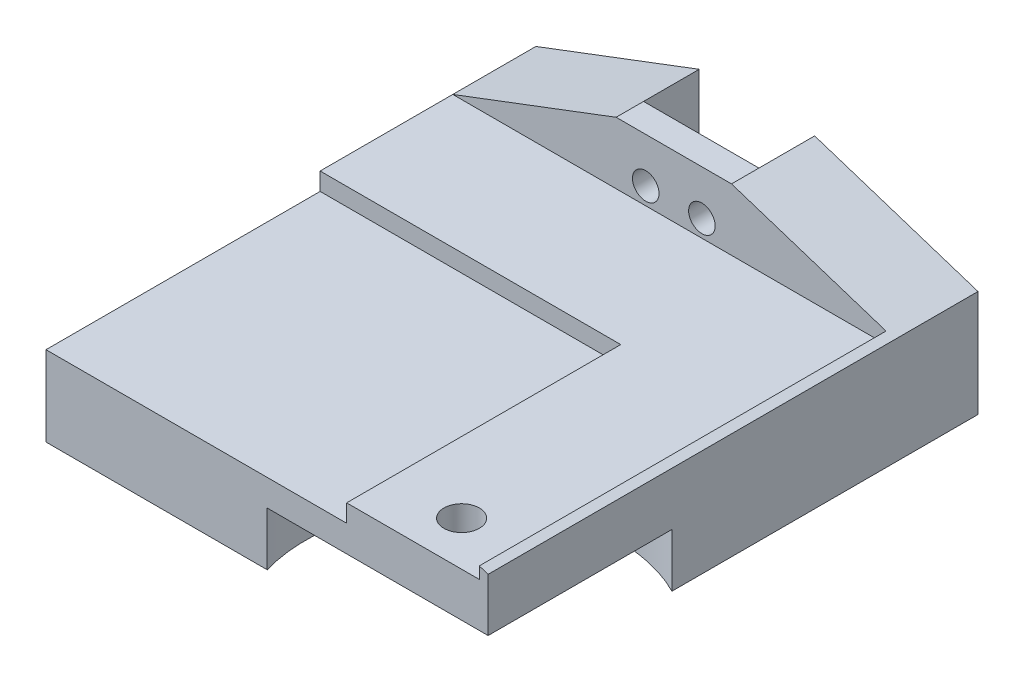
ISO-10303-21;
HEADER;
FILE_DESCRIPTION(('STEP AP214'),'2;1');
FILE_NAME('part.step','',(''),(''),'','','');
FILE_SCHEMA(('AUTOMOTIVE_DESIGN { 1 0 10303 214 1 1 1 1 }'));
ENDSEC;
DATA;
#1=APPLICATION_CONTEXT('core data for automotive mechanical design processes');
#2=APPLICATION_PROTOCOL_DEFINITION('international standard','automotive_design',2000,#1);
#3=PRODUCT_CONTEXT('',#1,'mechanical');
#4=PRODUCT('Part','Part','',(#3));
#5=PRODUCT_RELATED_PRODUCT_CATEGORY('part','',(#4));
#6=PRODUCT_DEFINITION_FORMATION('','',#4);
#7=PRODUCT_DEFINITION_CONTEXT('part definition',#1,'design');
#8=PRODUCT_DEFINITION('design','',#6,#7);
#9=PRODUCT_DEFINITION_SHAPE('','',#8);
#10=(LENGTH_UNIT() NAMED_UNIT(*) SI_UNIT(.MILLI.,.METRE.));
#11=(NAMED_UNIT(*) PLANE_ANGLE_UNIT() SI_UNIT($,.RADIAN.));
#12=(NAMED_UNIT(*) SI_UNIT($,.STERADIAN.) SOLID_ANGLE_UNIT());
#13=UNCERTAINTY_MEASURE_WITH_UNIT(LENGTH_MEASURE(1.E-05),#10,'distance_accuracy_value','');
#14=(GEOMETRIC_REPRESENTATION_CONTEXT(3) GLOBAL_UNCERTAINTY_ASSIGNED_CONTEXT((#13)) GLOBAL_UNIT_ASSIGNED_CONTEXT((#10,
#11,#12)) REPRESENTATION_CONTEXT('',''));
#15=CARTESIAN_POINT('',(0.,0.,0.));
#16=DIRECTION('',(0.,0.,1.));
#17=DIRECTION('',(1.,0.,0.));
#18=AXIS2_PLACEMENT_3D('',#15,#16,#17);
#19=CARTESIAN_POINT('',(42.,18.05,-5.));
#20=DIRECTION('',(0.,-1.,0.));
#21=DIRECTION('',(0.,0.,-1.));
#22=AXIS2_PLACEMENT_3D('',#19,#20,#21);
#23=CYLINDRICAL_SURFACE('',#22,2.);
#24=CARTESIAN_POINT('',(42.,11.05,-5.));
#25=DIRECTION('',(0.,-1.,0.));
#26=DIRECTION('',(0.,0.,-1.));
#27=AXIS2_PLACEMENT_3D('',#24,#25,#26);
#28=CIRCLE('',#27,2.);
#29=CARTESIAN_POINT('',(42.,11.05,-7.));
#30=VERTEX_POINT('',#29);
#31=EDGE_CURVE('E380',#30,#30,#28,.T.);
#32=ORIENTED_EDGE('',*,*,#31,.F.);
#33=EDGE_LOOP('',(#32));
#34=FACE_BOUND('',#33,.T.);
#35=CARTESIAN_POINT('',(42.,6.05,-5.));
#36=DIRECTION('',(0.,-1.,0.));
#37=DIRECTION('',(0.,0.,-1.));
#38=AXIS2_PLACEMENT_3D('',#35,#36,#37);
#39=CIRCLE('',#38,2.);
#40=CARTESIAN_POINT('',(42.,6.05,-7.));
#41=VERTEX_POINT('',#40);
#42=EDGE_CURVE('E237',#41,#41,#39,.T.);
#43=ORIENTED_EDGE('',*,*,#42,.T.);
#44=EDGE_LOOP('',(#43));
#45=FACE_BOUND('',#44,.T.);
#46=ADVANCED_FACE('F43',(#34,#45),#23,.F.);
#47=CARTESIAN_POINT('',(0.,18.05,-55.4));
#48=DIRECTION('',(0.,0.,1.));
#49=DIRECTION('',(1.,0.,0.));
#50=AXIS2_PLACEMENT_3D('',#47,#48,#49);
#51=PLANE('',#50);
#52=DIRECTION('',(0.,-1.,0.));
#53=VECTOR('',#52,1.);
#54=CARTESIAN_POINT('',(31.525,18.05,-55.4));
#55=LINE('',#54,#53);
#56=CARTESIAN_POINT('',(31.525,18.05,-55.4));
#57=VERTEX_POINT('',#56);
#58=CARTESIAN_POINT('',(31.525,6.,-55.4));
#59=VERTEX_POINT('',#58);
#60=EDGE_CURVE('E324',#57,#59,#55,.T.);
#61=ORIENTED_EDGE('',*,*,#60,.F.);
#62=DIRECTION('',(-0.951100252619325,0.308882355383819,0.));
#63=VECTOR('',#62,1.);
#64=CARTESIAN_POINT('',(31.525,18.05,-55.4));
#65=LINE('',#64,#63);
#66=CARTESIAN_POINT('',(50.,12.0499999999999,-55.4));
#67=VERTEX_POINT('',#66);
#68=EDGE_CURVE('E414',#57,#67,#65,.F.);
#69=ORIENTED_EDGE('',*,*,#68,.T.);
#70=DIRECTION('',(0.,-1.,0.));
#71=VECTOR('',#70,1.);
#72=CARTESIAN_POINT('',(50.,18.05,-55.4));
#73=LINE('',#72,#71);
#74=CARTESIAN_POINT('',(50.,0.,-55.4));
#75=VERTEX_POINT('',#74);
#76=EDGE_CURVE('E217',#67,#75,#73,.T.);
#77=ORIENTED_EDGE('',*,*,#76,.T.);
#78=DIRECTION('',(-1.,0.,0.));
#79=VECTOR('',#78,1.);
#80=CARTESIAN_POINT('',(0.,0.,-55.4));
#81=LINE('',#80,#79);
#82=CARTESIAN_POINT('',(25.875,0.,-55.4));
#83=VERTEX_POINT('',#82);
#84=EDGE_CURVE('E391',#75,#83,#81,.T.);
#85=ORIENTED_EDGE('',*,*,#84,.T.);
#86=DIRECTION('',(0.,1.,0.));
#87=VECTOR('',#86,1.);
#88=CARTESIAN_POINT('',(25.875,0.,-55.4));
#89=LINE('',#88,#87);
#90=CARTESIAN_POINT('',(25.875,6.,-55.4));
#91=VERTEX_POINT('',#90);
#92=EDGE_CURVE('E304',#83,#91,#89,.T.);
#93=ORIENTED_EDGE('',*,*,#92,.T.);
#94=DIRECTION('',(-1.,0.,0.));
#95=VECTOR('',#94,1.);
#96=CARTESIAN_POINT('',(31.525,6.,-55.4));
#97=LINE('',#96,#95);
#98=EDGE_CURVE('E349',#59,#91,#97,.T.);
#99=ORIENTED_EDGE('',*,*,#98,.F.);
#100=EDGE_LOOP('',(#61,#69,#77,#85,#93,#99));
#101=FACE_BOUND('',#100,.T.);
#102=ADVANCED_FACE('F420',(#101),#51,.F.);
#103=CARTESIAN_POINT('',(0.,18.05,0.));
#104=DIRECTION('',(0.,-1.,0.));
#105=DIRECTION('',(0.,0.,-1.));
#106=AXIS2_PLACEMENT_3D('',#103,#104,#105);
#107=PLANE('',#106);
#108=DIRECTION('',(-1.,0.,0.));
#109=VECTOR('',#108,1.);
#110=CARTESIAN_POINT('',(0.,18.05,-46.));
#111=LINE('',#110,#109);
#112=CARTESIAN_POINT('',(31.525,18.05,-46.));
#113=VERTEX_POINT('',#112);
#114=CARTESIAN_POINT('',(18.4750000000002,18.05,-46.));
#115=VERTEX_POINT('',#114);
#116=EDGE_CURVE('E356',#113,#115,#111,.T.);
#117=ORIENTED_EDGE('',*,*,#116,.F.);
#118=DIRECTION('',(0.,0.,-1.));
#119=VECTOR('',#118,1.);
#120=CARTESIAN_POINT('',(31.525,18.05,0.));
#121=LINE('',#120,#119);
#122=CARTESIAN_POINT('',(31.525,18.05,-49.1));
#123=VERTEX_POINT('',#122);
#124=EDGE_CURVE('E411',#113,#123,#121,.T.);
#125=ORIENTED_EDGE('',*,*,#124,.T.);
#126=DIRECTION('',(1.,0.,0.));
#127=VECTOR('',#126,1.);
#128=CARTESIAN_POINT('',(31.525,18.05,-49.1));
#129=LINE('',#128,#127);
#130=CARTESIAN_POINT('',(18.475,18.05,-49.1));
#131=VERTEX_POINT('',#130);
#132=EDGE_CURVE('E343',#131,#123,#129,.T.);
#133=ORIENTED_EDGE('',*,*,#132,.F.);
#134=DIRECTION('',(0.,0.,1.));
#135=VECTOR('',#134,1.);
#136=CARTESIAN_POINT('',(18.4750000000002,18.05,0.));
#137=LINE('',#136,#135);
#138=EDGE_CURVE('E398',#131,#115,#137,.T.);
#139=ORIENTED_EDGE('',*,*,#138,.T.);
#140=EDGE_LOOP('',(#117,#125,#133,#139));
#141=FACE_BOUND('',#140,.T.);
#142=ADVANCED_FACE('F432',(#141),#107,.F.);
#143=CARTESIAN_POINT('',(0.,0.,0.));
#144=DIRECTION('',(0.,-1.,0.));
#145=DIRECTION('',(0.,0.,-1.));
#146=AXIS2_PLACEMENT_3D('',#143,#144,#145);
#147=PLANE('',#146);
#148=CARTESIAN_POINT('',(42.,0.,-5.));
#149=DIRECTION('',(0.,-1.,0.));
#150=DIRECTION('',(0.,0.,-1.));
#151=AXIS2_PLACEMENT_3D('',#148,#149,#150);
#152=CIRCLE('',#151,17.7);
#153=CARTESIAN_POINT('',(25.0208951943867,0.,0.));
#154=VERTEX_POINT('',#153);
#155=CARTESIAN_POINT('',(50.,0.,-20.7889201657365));
#156=VERTEX_POINT('',#155);
#157=EDGE_CURVE('E225',#154,#156,#152,.T.);
#158=ORIENTED_EDGE('',*,*,#157,.F.);
#159=DIRECTION('',(1.,0.,0.));
#160=VECTOR('',#159,1.);
#161=CARTESIAN_POINT('',(0.,0.,0.));
#162=LINE('',#161,#160);
#163=CARTESIAN_POINT('',(0.,0.,0.));
#164=VERTEX_POINT('',#163);
#165=EDGE_CURVE('E385',#164,#154,#162,.T.);
#166=ORIENTED_EDGE('',*,*,#165,.F.);
#167=DIRECTION('',(0.,0.,1.));
#168=VECTOR('',#167,1.);
#169=CARTESIAN_POINT('',(0.,0.,0.));
#170=LINE('',#169,#168);
#171=CARTESIAN_POINT('',(0.,0.,-55.4));
#172=VERTEX_POINT('',#171);
#173=EDGE_CURVE('E382',#172,#164,#170,.T.);
#174=ORIENTED_EDGE('',*,*,#173,.F.);
#175=CARTESIAN_POINT('',(24.125,0.,-55.4));
#176=VERTEX_POINT('',#175);
#177=EDGE_CURVE('E390',#176,#172,#81,.T.);
#178=ORIENTED_EDGE('',*,*,#177,.F.);
#179=DIRECTION('',(0.,0.,1.));
#180=VECTOR('',#179,1.);
#181=CARTESIAN_POINT('',(24.125,0.,-55.4));
#182=LINE('',#181,#180);
#183=CARTESIAN_POINT('',(24.125,0.,-53.65));
#184=VERTEX_POINT('',#183);
#185=EDGE_CURVE('E263',#176,#184,#182,.T.);
#186=ORIENTED_EDGE('',*,*,#185,.T.);
#187=DIRECTION('',(-1.,0.,0.));
#188=VECTOR('',#187,1.);
#189=CARTESIAN_POINT('',(24.125,0.,-53.65));
#190=LINE('',#189,#188);
#191=CARTESIAN_POINT('',(23.125,0.,-53.65));
#192=VERTEX_POINT('',#191);
#193=EDGE_CURVE('E266',#184,#192,#190,.T.);
#194=ORIENTED_EDGE('',*,*,#193,.T.);
#195=DIRECTION('',(0.,0.,1.));
#196=VECTOR('',#195,1.);
#197=CARTESIAN_POINT('',(23.125,0.,-53.65));
#198=LINE('',#197,#196);
#199=CARTESIAN_POINT('',(23.125,0.,-51.9));
#200=VERTEX_POINT('',#199);
#201=EDGE_CURVE('E270',#192,#200,#198,.T.);
#202=ORIENTED_EDGE('',*,*,#201,.T.);
#203=DIRECTION('',(1.,0.,0.));
#204=VECTOR('',#203,1.);
#205=CARTESIAN_POINT('',(23.125,0.,-51.9));
#206=LINE('',#205,#204);
#207=CARTESIAN_POINT('',(26.875,0.,-51.9));
#208=VERTEX_POINT('',#207);
#209=EDGE_CURVE('E273',#200,#208,#206,.T.);
#210=ORIENTED_EDGE('',*,*,#209,.T.);
#211=DIRECTION('',(0.,0.,-1.));
#212=VECTOR('',#211,1.);
#213=CARTESIAN_POINT('',(26.875,0.,-51.9));
#214=LINE('',#213,#212);
#215=CARTESIAN_POINT('',(26.875,0.,-53.65));
#216=VERTEX_POINT('',#215);
#217=EDGE_CURVE('E276',#208,#216,#214,.T.);
#218=ORIENTED_EDGE('',*,*,#217,.T.);
#219=DIRECTION('',(-1.,0.,0.));
#220=VECTOR('',#219,1.);
#221=CARTESIAN_POINT('',(26.875,0.,-53.65));
#222=LINE('',#221,#220);
#223=CARTESIAN_POINT('',(25.875,0.,-53.65));
#224=VERTEX_POINT('',#223);
#225=EDGE_CURVE('E279',#216,#224,#222,.T.);
#226=ORIENTED_EDGE('',*,*,#225,.T.);
#227=DIRECTION('',(0.,0.,-1.));
#228=VECTOR('',#227,1.);
#229=CARTESIAN_POINT('',(25.875,0.,-53.65));
#230=LINE('',#229,#228);
#231=EDGE_CURVE('E282',#224,#83,#230,.T.);
#232=ORIENTED_EDGE('',*,*,#231,.T.);
#233=ORIENTED_EDGE('',*,*,#84,.F.);
#234=DIRECTION('',(0.,0.,-1.));
#235=VECTOR('',#234,1.);
#236=CARTESIAN_POINT('',(50.,0.,0.));
#237=LINE('',#236,#235);
#238=EDGE_CURVE('E387',#156,#75,#237,.T.);
#239=ORIENTED_EDGE('',*,*,#238,.F.);
#240=EDGE_LOOP('',(#158,#166,#174,#178,#186,#194,#202,#210,#218,#226,#232,#233,#239));
#241=FACE_BOUND('',#240,.T.);
#242=ADVANCED_FACE('F490',(#241),#147,.T.);
#243=CARTESIAN_POINT('',(0.,18.05,0.));
#244=DIRECTION('',(1.,0.,0.));
#245=DIRECTION('',(0.,0.,-1.));
#246=AXIS2_PLACEMENT_3D('',#243,#244,#245);
#247=PLANE('',#246);
#248=DIRECTION('',(0.,0.,1.));
#249=VECTOR('',#248,1.);
#250=CARTESIAN_POINT('',(0.,11.05,0.));
#251=LINE('',#250,#249);
#252=CARTESIAN_POINT('',(0.,11.05,-46.));
#253=VERTEX_POINT('',#252);
#254=CARTESIAN_POINT('',(0.,11.05,-31.));
#255=VERTEX_POINT('',#254);
#256=EDGE_CURVE('E365',#253,#255,#251,.T.);
#257=ORIENTED_EDGE('',*,*,#256,.F.);
#258=DIRECTION('',(0.,0.,-1.));
#259=VECTOR('',#258,1.);
#260=CARTESIAN_POINT('',(0.,11.05,0.));
#261=LINE('',#260,#259);
#262=CARTESIAN_POINT('',(0.,11.05,-55.4));
#263=VERTEX_POINT('',#262);
#264=EDGE_CURVE('E407',#253,#263,#261,.T.);
#265=ORIENTED_EDGE('',*,*,#264,.T.);
#266=DIRECTION('',(0.,-1.,0.));
#267=VECTOR('',#266,1.);
#268=CARTESIAN_POINT('',(0.,18.05,-55.4));
#269=LINE('',#268,#267);
#270=EDGE_CURVE('E394',#263,#172,#269,.T.);
#271=ORIENTED_EDGE('',*,*,#270,.T.);
#272=ORIENTED_EDGE('',*,*,#173,.T.);
#273=DIRECTION('',(0.,-1.,0.));
#274=VECTOR('',#273,1.);
#275=CARTESIAN_POINT('',(0.,18.05,0.));
#276=LINE('',#275,#274);
#277=CARTESIAN_POINT('',(0.,9.05,0.));
#278=VERTEX_POINT('',#277);
#279=EDGE_CURVE('E216',#278,#164,#276,.T.);
#280=ORIENTED_EDGE('',*,*,#279,.F.);
#281=DIRECTION('',(0.,0.,1.));
#282=VECTOR('',#281,1.);
#283=CARTESIAN_POINT('',(0.,9.05,0.));
#284=LINE('',#283,#282);
#285=CARTESIAN_POINT('',(0.,9.05,-31.));
#286=VERTEX_POINT('',#285);
#287=EDGE_CURVE('E239',#286,#278,#284,.T.);
#288=ORIENTED_EDGE('',*,*,#287,.F.);
#289=DIRECTION('',(0.,1.,0.));
#290=VECTOR('',#289,1.);
#291=CARTESIAN_POINT('',(0.,9.05,-31.));
#292=LINE('',#291,#290);
#293=EDGE_CURVE('E256',#286,#255,#292,.T.);
#294=ORIENTED_EDGE('',*,*,#293,.T.);
#295=EDGE_LOOP('',(#257,#265,#271,#272,#280,#288,#294));
#296=FACE_BOUND('',#295,.T.);
#297=ADVANCED_FACE('F447',(#296),#247,.F.);
#298=CARTESIAN_POINT('',(0.,18.05,0.));
#299=DIRECTION('',(0.,0.,-1.));
#300=DIRECTION('',(-1.,0.,0.));
#301=AXIS2_PLACEMENT_3D('',#298,#299,#300);
#302=PLANE('',#301);
#303=DIRECTION('',(0.,-1.,0.));
#304=VECTOR('',#303,1.);
#305=CARTESIAN_POINT('',(50.,18.05,0.));
#306=LINE('',#305,#304);
#307=CARTESIAN_POINT('',(50.,12.0499999999999,0.));
#308=VERTEX_POINT('',#307);
#309=CARTESIAN_POINT('',(50.,6.05,0.));
#310=VERTEX_POINT('',#309);
#311=EDGE_CURVE('E207',#308,#310,#306,.T.);
#312=ORIENTED_EDGE('',*,*,#311,.F.);
#313=DIRECTION('',(0.951100252619325,-0.308882355383819,0.));
#314=VECTOR('',#313,1.);
#315=CARTESIAN_POINT('',(31.525,18.05,0.));
#316=LINE('',#315,#314);
#317=CARTESIAN_POINT('',(49.,12.3747631935046,0.));
#318=VERTEX_POINT('',#317);
#319=EDGE_CURVE('E66',#308,#318,#316,.F.);
#320=ORIENTED_EDGE('',*,*,#319,.T.);
#321=DIRECTION('',(0.,1.,0.));
#322=VECTOR('',#321,1.);
#323=CARTESIAN_POINT('',(49.,11.05,0.));
#324=LINE('',#323,#322);
#325=CARTESIAN_POINT('',(49.,11.05,0.));
#326=VERTEX_POINT('',#325);
#327=EDGE_CURVE('E376',#326,#318,#324,.T.);
#328=ORIENTED_EDGE('',*,*,#327,.F.);
#329=DIRECTION('',(1.,0.,0.));
#330=VECTOR('',#329,1.);
#331=CARTESIAN_POINT('',(0.,11.05,0.));
#332=LINE('',#331,#330);
#333=CARTESIAN_POINT('',(34.,11.05,0.));
#334=VERTEX_POINT('',#333);
#335=EDGE_CURVE('E368',#334,#326,#332,.T.);
#336=ORIENTED_EDGE('',*,*,#335,.F.);
#337=DIRECTION('',(0.,1.,0.));
#338=VECTOR('',#337,1.);
#339=CARTESIAN_POINT('',(34.,9.05,0.));
#340=LINE('',#339,#338);
#341=CARTESIAN_POINT('',(34.,9.05,0.));
#342=VERTEX_POINT('',#341);
#343=EDGE_CURVE('E251',#342,#334,#340,.T.);
#344=ORIENTED_EDGE('',*,*,#343,.F.);
#345=DIRECTION('',(1.,0.,0.));
#346=VECTOR('',#345,1.);
#347=CARTESIAN_POINT('',(0.,9.05,0.));
#348=LINE('',#347,#346);
#349=EDGE_CURVE('E241',#278,#342,#348,.T.);
#350=ORIENTED_EDGE('',*,*,#349,.F.);
#351=ORIENTED_EDGE('',*,*,#279,.T.);
#352=ORIENTED_EDGE('',*,*,#165,.T.);
#353=DIRECTION('',(0.,-1.,0.));
#354=VECTOR('',#353,1.);
#355=CARTESIAN_POINT('',(25.0208951943867,6.05,0.));
#356=LINE('',#355,#354);
#357=CARTESIAN_POINT('',(25.0208951943867,6.05,0.));
#358=VERTEX_POINT('',#357);
#359=EDGE_CURVE('E230',#358,#154,#356,.T.);
#360=ORIENTED_EDGE('',*,*,#359,.F.);
#361=DIRECTION('',(-1.,0.,0.));
#362=VECTOR('',#361,1.);
#363=CARTESIAN_POINT('',(25.0208951943867,6.05,0.));
#364=LINE('',#363,#362);
#365=EDGE_CURVE('E221',#310,#358,#364,.T.);
#366=ORIENTED_EDGE('',*,*,#365,.F.);
#367=EDGE_LOOP('',(#312,#320,#328,#336,#344,#350,#351,#352,#360,#366));
#368=FACE_BOUND('',#367,.T.);
#369=ADVANCED_FACE('F228',(#368),#302,.F.);
#370=CARTESIAN_POINT('',(50.,18.05,0.));
#371=DIRECTION('',(-1.,0.,0.));
#372=DIRECTION('',(0.,0.,1.));
#373=AXIS2_PLACEMENT_3D('',#370,#371,#372);
#374=PLANE('',#373);
#375=ORIENTED_EDGE('',*,*,#76,.F.);
#376=DIRECTION('',(0.,0.,1.));
#377=VECTOR('',#376,1.);
#378=CARTESIAN_POINT('',(50.,12.0499999999999,0.));
#379=LINE('',#378,#377);
#380=EDGE_CURVE('E214',#67,#308,#379,.T.);
#381=ORIENTED_EDGE('',*,*,#380,.T.);
#382=ORIENTED_EDGE('',*,*,#311,.T.);
#383=DIRECTION('',(0.,0.,1.));
#384=VECTOR('',#383,1.);
#385=CARTESIAN_POINT('',(50.,6.05,0.));
#386=LINE('',#385,#384);
#387=CARTESIAN_POINT('',(50.,6.05,-20.7889201657365));
#388=VERTEX_POINT('',#387);
#389=EDGE_CURVE('E212',#388,#310,#386,.T.);
#390=ORIENTED_EDGE('',*,*,#389,.F.);
#391=DIRECTION('',(0.,-1.,0.));
#392=VECTOR('',#391,1.);
#393=CARTESIAN_POINT('',(50.,6.05,-20.7889201657365));
#394=LINE('',#393,#392);
#395=EDGE_CURVE('E235',#388,#156,#394,.T.);
#396=ORIENTED_EDGE('',*,*,#395,.T.);
#397=ORIENTED_EDGE('',*,*,#238,.T.);
#398=EDGE_LOOP('',(#375,#381,#382,#390,#396,#397));
#399=FACE_BOUND('',#398,.T.);
#400=ADVANCED_FACE('F210',(#399),#374,.F.);
#401=ORIENTED_EDGE('',*,*,#270,.F.);
#402=DIRECTION('',(-0.935127685959478,-0.35431089589804,0.));
#403=VECTOR('',#402,1.);
#404=CARTESIAN_POINT('',(18.4750000000002,18.05,-55.4));
#405=LINE('',#404,#403);
#406=CARTESIAN_POINT('',(18.475,18.05,-55.4));
#407=VERTEX_POINT('',#406);
#408=EDGE_CURVE('E409',#263,#407,#405,.F.);
#409=ORIENTED_EDGE('',*,*,#408,.T.);
#410=DIRECTION('',(0.,1.,0.));
#411=VECTOR('',#410,1.);
#412=CARTESIAN_POINT('',(18.475,18.05,-55.4));
#413=LINE('',#412,#411);
#414=CARTESIAN_POINT('',(18.475,6.,-55.4));
#415=VERTEX_POINT('',#414);
#416=EDGE_CURVE('E337',#415,#407,#413,.T.);
#417=ORIENTED_EDGE('',*,*,#416,.F.);
#418=CARTESIAN_POINT('',(24.125,6.,-55.4));
#419=VERTEX_POINT('',#418);
#420=EDGE_CURVE('E348',#419,#415,#97,.T.);
#421=ORIENTED_EDGE('',*,*,#420,.F.);
#422=DIRECTION('',(0.,1.,0.));
#423=VECTOR('',#422,1.);
#424=CARTESIAN_POINT('',(24.125,0.,-55.4));
#425=LINE('',#424,#423);
#426=EDGE_CURVE('E285',#176,#419,#425,.T.);
#427=ORIENTED_EDGE('',*,*,#426,.F.);
#428=ORIENTED_EDGE('',*,*,#177,.T.);
#429=EDGE_LOOP('',(#401,#409,#417,#421,#427,#428));
#430=FACE_BOUND('',#429,.T.);
#431=ADVANCED_FACE('F473',(#430),#51,.F.);
#432=CARTESIAN_POINT('',(0.,11.05,-46.));
#433=DIRECTION('',(0.,0.,-1.));
#434=DIRECTION('',(-1.,0.,0.));
#435=AXIS2_PLACEMENT_3D('',#432,#433,#434);
#436=PLANE('',#435);
#437=CARTESIAN_POINT('',(28.175,13.,-46.));
#438=DIRECTION('',(0.,0.,-1.));
#439=DIRECTION('',(-1.,0.,0.));
#440=AXIS2_PLACEMENT_3D('',#437,#438,#439);
#441=CIRCLE('',#440,1.5);
#442=CARTESIAN_POINT('',(26.675,13.,-46.));
#443=VERTEX_POINT('',#442);
#444=EDGE_CURVE('E321',#443,#443,#441,.T.);
#445=ORIENTED_EDGE('',*,*,#444,.T.);
#446=EDGE_LOOP('',(#445));
#447=FACE_BOUND('',#446,.T.);
#448=CARTESIAN_POINT('',(21.825,13.,-46.));
#449=DIRECTION('',(0.,0.,-1.));
#450=DIRECTION('',(-1.,0.,0.));
#451=AXIS2_PLACEMENT_3D('',#448,#449,#450);
#452=CIRCLE('',#451,1.5);
#453=CARTESIAN_POINT('',(20.325,13.,-46.));
#454=VERTEX_POINT('',#453);
#455=EDGE_CURVE('E307',#454,#454,#452,.T.);
#456=ORIENTED_EDGE('',*,*,#455,.T.);
#457=EDGE_LOOP('',(#456));
#458=FACE_BOUND('',#457,.T.);
#459=DIRECTION('',(0.,1.,0.));
#460=VECTOR('',#459,1.);
#461=CARTESIAN_POINT('',(49.,11.05,-46.));
#462=LINE('',#461,#460);
#463=CARTESIAN_POINT('',(49.,11.05,-46.));
#464=VERTEX_POINT('',#463);
#465=CARTESIAN_POINT('',(49.,12.3747631935046,-46.));
#466=VERTEX_POINT('',#465);
#467=EDGE_CURVE('E378',#464,#466,#462,.T.);
#468=ORIENTED_EDGE('',*,*,#467,.T.);
#469=DIRECTION('',(0.951100252619325,-0.308882355383819,0.));
#470=VECTOR('',#469,1.);
#471=CARTESIAN_POINT('',(31.525,18.05,-46.));
#472=LINE('',#471,#470);
#473=EDGE_CURVE('E11',#466,#113,#472,.F.);
#474=ORIENTED_EDGE('',*,*,#473,.T.);
#475=ORIENTED_EDGE('',*,*,#116,.T.);
#476=DIRECTION('',(0.935127685959478,0.35431089589804,0.));
#477=VECTOR('',#476,1.);
#478=CARTESIAN_POINT('',(18.4750000000002,18.05,-46.));
#479=LINE('',#478,#477);
#480=EDGE_CURVE('E405',#115,#253,#479,.F.);
#481=ORIENTED_EDGE('',*,*,#480,.T.);
#482=DIRECTION('',(-1.,0.,0.));
#483=VECTOR('',#482,1.);
#484=CARTESIAN_POINT('',(0.,11.05,-46.));
#485=LINE('',#484,#483);
#486=EDGE_CURVE('E373',#464,#253,#485,.T.);
#487=ORIENTED_EDGE('',*,*,#486,.F.);
#488=EDGE_LOOP('',(#468,#474,#475,#481,#487));
#489=FACE_BOUND('',#488,.T.);
#490=ADVANCED_FACE('F429',(#447,#458,#489),#436,.F.);
#491=CARTESIAN_POINT('',(49.,11.05,0.));
#492=DIRECTION('',(1.,0.,0.));
#493=DIRECTION('',(0.,0.,-1.));
#494=AXIS2_PLACEMENT_3D('',#491,#492,#493);
#495=PLANE('',#494);
#496=ORIENTED_EDGE('',*,*,#327,.T.);
#497=DIRECTION('',(0.,0.,1.));
#498=VECTOR('',#497,1.);
#499=CARTESIAN_POINT('',(49.,12.3747631935046,0.));
#500=LINE('',#499,#498);
#501=EDGE_CURVE('E52',#318,#466,#500,.F.);
#502=ORIENTED_EDGE('',*,*,#501,.T.);
#503=ORIENTED_EDGE('',*,*,#467,.F.);
#504=DIRECTION('',(0.,0.,-1.));
#505=VECTOR('',#504,1.);
#506=CARTESIAN_POINT('',(49.,11.05,0.));
#507=LINE('',#506,#505);
#508=EDGE_CURVE('E370',#326,#464,#507,.T.);
#509=ORIENTED_EDGE('',*,*,#508,.F.);
#510=EDGE_LOOP('',(#496,#502,#503,#509));
#511=FACE_BOUND('',#510,.T.);
#512=ADVANCED_FACE('F462',(#511),#495,.F.);
#513=CARTESIAN_POINT('',(0.,11.05,0.));
#514=DIRECTION('',(0.,-1.,0.));
#515=DIRECTION('',(0.,0.,-1.));
#516=AXIS2_PLACEMENT_3D('',#513,#514,#515);
#517=PLANE('',#516);
#518=ORIENTED_EDGE('',*,*,#31,.T.);
#519=EDGE_LOOP('',(#518));
#520=FACE_BOUND('',#519,.T.);
#521=ORIENTED_EDGE('',*,*,#256,.T.);
#522=DIRECTION('',(-1.,0.,0.));
#523=VECTOR('',#522,1.);
#524=CARTESIAN_POINT('',(0.,11.05,-31.));
#525=LINE('',#524,#523);
#526=CARTESIAN_POINT('',(34.,11.05,-31.));
#527=VERTEX_POINT('',#526);
#528=EDGE_CURVE('E242',#527,#255,#525,.T.);
#529=ORIENTED_EDGE('',*,*,#528,.F.);
#530=DIRECTION('',(0.,0.,-1.));
#531=VECTOR('',#530,1.);
#532=CARTESIAN_POINT('',(34.,11.05,0.));
#533=LINE('',#532,#531);
#534=EDGE_CURVE('E252',#334,#527,#533,.T.);
#535=ORIENTED_EDGE('',*,*,#534,.F.);
#536=ORIENTED_EDGE('',*,*,#335,.T.);
#537=ORIENTED_EDGE('',*,*,#508,.T.);
#538=ORIENTED_EDGE('',*,*,#486,.T.);
#539=EDGE_LOOP('',(#521,#529,#535,#536,#537,#538));
#540=FACE_BOUND('',#539,.T.);
#541=ADVANCED_FACE('F443',(#520,#540),#517,.F.);
#542=CARTESIAN_POINT('',(31.525,18.05,-49.1));
#543=DIRECTION('',(1.,0.,0.));
#544=DIRECTION('',(0.,0.,-1.));
#545=AXIS2_PLACEMENT_3D('',#542,#543,#544);
#546=PLANE('',#545);
#547=ORIENTED_EDGE('',*,*,#60,.T.);
#548=DIRECTION('',(0.,0.,-1.));
#549=VECTOR('',#548,1.);
#550=CARTESIAN_POINT('',(31.525,6.,-49.1));
#551=LINE('',#550,#549);
#552=CARTESIAN_POINT('',(31.525,6.,-49.1));
#553=VERTEX_POINT('',#552);
#554=EDGE_CURVE('E346',#553,#59,#551,.T.);
#555=ORIENTED_EDGE('',*,*,#554,.F.);
#556=DIRECTION('',(0.,-1.,0.));
#557=VECTOR('',#556,1.);
#558=CARTESIAN_POINT('',(31.525,18.05,-49.1));
#559=LINE('',#558,#557);
#560=EDGE_CURVE('E333',#123,#553,#559,.T.);
#561=ORIENTED_EDGE('',*,*,#560,.F.);
#562=DIRECTION('',(0.,0.,-1.));
#563=VECTOR('',#562,1.);
#564=CARTESIAN_POINT('',(31.525,18.05,-49.1));
#565=LINE('',#564,#563);
#566=EDGE_CURVE('E354',#123,#57,#565,.T.);
#567=ORIENTED_EDGE('',*,*,#566,.T.);
#568=EDGE_LOOP('',(#547,#555,#561,#567));
#569=FACE_BOUND('',#568,.T.);
#570=ADVANCED_FACE('F470',(#569),#546,.F.);
#571=CARTESIAN_POINT('',(18.475,18.05,-49.1));
#572=DIRECTION('',(-1.,0.,0.));
#573=DIRECTION('',(0.,0.,1.));
#574=AXIS2_PLACEMENT_3D('',#571,#572,#573);
#575=PLANE('',#574);
#576=ORIENTED_EDGE('',*,*,#416,.T.);
#577=DIRECTION('',(0.,0.,-1.));
#578=VECTOR('',#577,1.);
#579=CARTESIAN_POINT('',(18.475,18.05,-49.1));
#580=LINE('',#579,#578);
#581=EDGE_CURVE('E357',#131,#407,#580,.T.);
#582=ORIENTED_EDGE('',*,*,#581,.F.);
#583=DIRECTION('',(0.,1.,0.));
#584=VECTOR('',#583,1.);
#585=CARTESIAN_POINT('',(18.475,18.05,-49.1));
#586=LINE('',#585,#584);
#587=CARTESIAN_POINT('',(18.475,6.,-49.1));
#588=VERTEX_POINT('',#587);
#589=EDGE_CURVE('E340',#588,#131,#586,.T.);
#590=ORIENTED_EDGE('',*,*,#589,.F.);
#591=DIRECTION('',(0.,0.,-1.));
#592=VECTOR('',#591,1.);
#593=CARTESIAN_POINT('',(18.475,6.,-49.1));
#594=LINE('',#593,#592);
#595=EDGE_CURVE('E360',#588,#415,#594,.T.);
#596=ORIENTED_EDGE('',*,*,#595,.T.);
#597=EDGE_LOOP('',(#576,#582,#590,#596));
#598=FACE_BOUND('',#597,.T.);
#599=ADVANCED_FACE('F565',(#598),#575,.F.);
#600=CARTESIAN_POINT('',(31.525,6.,-49.1));
#601=DIRECTION('',(0.,-1.,0.));
#602=DIRECTION('',(1.,0.,0.));
#603=AXIS2_PLACEMENT_3D('',#600,#601,#602);
#604=PLANE('',#603);
#605=ORIENTED_EDGE('',*,*,#98,.T.);
#606=DIRECTION('',(0.,0.,-1.));
#607=VECTOR('',#606,1.);
#608=CARTESIAN_POINT('',(25.875,6.,-53.65));
#609=LINE('',#608,#607);
#610=CARTESIAN_POINT('',(25.875,6.,-53.65));
#611=VERTEX_POINT('',#610);
#612=EDGE_CURVE('E267',#611,#91,#609,.T.);
#613=ORIENTED_EDGE('',*,*,#612,.F.);
#614=DIRECTION('',(-1.,0.,0.));
#615=VECTOR('',#614,1.);
#616=CARTESIAN_POINT('',(26.875,6.,-53.65));
#617=LINE('',#616,#615);
#618=CARTESIAN_POINT('',(26.875,6.,-53.65));
#619=VERTEX_POINT('',#618);
#620=EDGE_CURVE('E300',#619,#611,#617,.T.);
#621=ORIENTED_EDGE('',*,*,#620,.F.);
#622=DIRECTION('',(0.,0.,-1.));
#623=VECTOR('',#622,1.);
#624=CARTESIAN_POINT('',(26.875,6.,-51.9));
#625=LINE('',#624,#623);
#626=CARTESIAN_POINT('',(26.875,6.,-51.9));
#627=VERTEX_POINT('',#626);
#628=EDGE_CURVE('E297',#627,#619,#625,.T.);
#629=ORIENTED_EDGE('',*,*,#628,.F.);
#630=DIRECTION('',(1.,0.,0.));
#631=VECTOR('',#630,1.);
#632=CARTESIAN_POINT('',(23.125,6.,-51.9));
#633=LINE('',#632,#631);
#634=CARTESIAN_POINT('',(23.125,6.,-51.9));
#635=VERTEX_POINT('',#634);
#636=EDGE_CURVE('E294',#635,#627,#633,.T.);
#637=ORIENTED_EDGE('',*,*,#636,.F.);
#638=DIRECTION('',(0.,0.,1.));
#639=VECTOR('',#638,1.);
#640=CARTESIAN_POINT('',(23.125,6.,-53.65));
#641=LINE('',#640,#639);
#642=CARTESIAN_POINT('',(23.125,6.,-53.65));
#643=VERTEX_POINT('',#642);
#644=EDGE_CURVE('E291',#643,#635,#641,.T.);
#645=ORIENTED_EDGE('',*,*,#644,.F.);
#646=DIRECTION('',(-1.,0.,0.));
#647=VECTOR('',#646,1.);
#648=CARTESIAN_POINT('',(24.125,6.,-53.65));
#649=LINE('',#648,#647);
#650=CARTESIAN_POINT('',(24.125,6.,-53.65));
#651=VERTEX_POINT('',#650);
#652=EDGE_CURVE('E288',#651,#643,#649,.T.);
#653=ORIENTED_EDGE('',*,*,#652,.F.);
#654=DIRECTION('',(0.,0.,1.));
#655=VECTOR('',#654,1.);
#656=CARTESIAN_POINT('',(24.125,6.,-55.4));
#657=LINE('',#656,#655);
#658=EDGE_CURVE('E259',#419,#651,#657,.T.);
#659=ORIENTED_EDGE('',*,*,#658,.F.);
#660=ORIENTED_EDGE('',*,*,#420,.T.);
#661=ORIENTED_EDGE('',*,*,#595,.F.);
#662=DIRECTION('',(-1.,0.,0.));
#663=VECTOR('',#662,1.);
#664=CARTESIAN_POINT('',(31.525,6.,-49.1));
#665=LINE('',#664,#663);
#666=EDGE_CURVE('E336',#553,#588,#665,.T.);
#667=ORIENTED_EDGE('',*,*,#666,.F.);
#668=ORIENTED_EDGE('',*,*,#554,.T.);
#669=EDGE_LOOP('',(#605,#613,#621,#629,#637,#645,#653,#659,#660,#661,#667,#668));
#670=FACE_BOUND('',#669,.T.);
#671=ADVANCED_FACE('F563',(#670),#604,.F.);
#672=CARTESIAN_POINT('',(0.,0.,-49.1));
#673=DIRECTION('',(0.,0.,-1.));
#674=DIRECTION('',(-1.,0.,0.));
#675=AXIS2_PLACEMENT_3D('',#672,#673,#674);
#676=PLANE('',#675);
#677=CARTESIAN_POINT('',(28.175,13.,-49.1));
#678=DIRECTION('',(0.,0.,-1.));
#679=DIRECTION('',(-1.,0.,0.));
#680=AXIS2_PLACEMENT_3D('',#677,#678,#679);
#681=CIRCLE('',#680,1.5);
#682=CARTESIAN_POINT('',(26.675,13.,-49.1));
#683=VERTEX_POINT('',#682);
#684=EDGE_CURVE('E325',#683,#683,#681,.T.);
#685=ORIENTED_EDGE('',*,*,#684,.F.);
#686=EDGE_LOOP('',(#685));
#687=FACE_BOUND('',#686,.T.);
#688=CARTESIAN_POINT('',(21.825,13.,-49.1));
#689=DIRECTION('',(0.,0.,-1.));
#690=DIRECTION('',(-1.,0.,0.));
#691=AXIS2_PLACEMENT_3D('',#688,#689,#690);
#692=CIRCLE('',#691,1.5);
#693=CARTESIAN_POINT('',(20.325,13.,-49.1));
#694=VERTEX_POINT('',#693);
#695=EDGE_CURVE('E328',#694,#694,#692,.T.);
#696=ORIENTED_EDGE('',*,*,#695,.F.);
#697=EDGE_LOOP('',(#696));
#698=FACE_BOUND('',#697,.T.);
#699=ORIENTED_EDGE('',*,*,#560,.T.);
#700=ORIENTED_EDGE('',*,*,#666,.T.);
#701=ORIENTED_EDGE('',*,*,#589,.T.);
#702=ORIENTED_EDGE('',*,*,#132,.T.);
#703=EDGE_LOOP('',(#699,#700,#701,#702));
#704=FACE_BOUND('',#703,.T.);
#705=ADVANCED_FACE('F559',(#687,#698,#704),#676,.T.);
#706=CARTESIAN_POINT('',(21.825,13.,-46.));
#707=DIRECTION('',(0.,0.,-1.));
#708=DIRECTION('',(-1.,0.,0.));
#709=AXIS2_PLACEMENT_3D('',#706,#707,#708);
#710=CYLINDRICAL_SURFACE('',#709,1.5);
#711=CARTESIAN_POINT('',(20.325,13.,-46.));
#712=CARTESIAN_POINT('',(20.325,13.,-46.0322916666667));
#713=CARTESIAN_POINT('',(20.325,13.,-46.0645833333333));
#714=CARTESIAN_POINT('',(20.325,13.,-46.1291666666667));
#715=CARTESIAN_POINT('',(20.325,13.,-46.1614583333333));
#716=CARTESIAN_POINT('',(20.325,13.,-46.2260416666667));
#717=CARTESIAN_POINT('',(20.325,13.,-46.2583333333333));
#718=CARTESIAN_POINT('',(20.325,13.,-46.3229166666667));
#719=CARTESIAN_POINT('',(20.325,13.,-46.3552083333333));
#720=CARTESIAN_POINT('',(20.325,13.,-46.4197916666667));
#721=CARTESIAN_POINT('',(20.325,13.,-46.4520833333333));
#722=CARTESIAN_POINT('',(20.325,13.,-46.5166666666667));
#723=CARTESIAN_POINT('',(20.325,13.,-46.5489583333333));
#724=CARTESIAN_POINT('',(20.325,13.,-46.6135416666667));
#725=CARTESIAN_POINT('',(20.325,13.,-46.6458333333333));
#726=CARTESIAN_POINT('',(20.325,13.,-46.7104166666667));
#727=CARTESIAN_POINT('',(20.325,13.,-46.7427083333333));
#728=CARTESIAN_POINT('',(20.325,13.,-46.8072916666667));
#729=CARTESIAN_POINT('',(20.325,13.,-46.8395833333333));
#730=CARTESIAN_POINT('',(20.325,13.,-46.9041666666667));
#731=CARTESIAN_POINT('',(20.325,13.,-46.9364583333333));
#732=CARTESIAN_POINT('',(20.325,13.,-47.0010416666667));
#733=CARTESIAN_POINT('',(20.325,13.,-47.0333333333333));
#734=CARTESIAN_POINT('',(20.325,13.,-47.0979166666667));
#735=CARTESIAN_POINT('',(20.325,13.,-47.1302083333333));
#736=CARTESIAN_POINT('',(20.325,13.,-47.1947916666667));
#737=CARTESIAN_POINT('',(20.325,13.,-47.2270833333333));
#738=CARTESIAN_POINT('',(20.325,13.,-47.2916666666667));
#739=CARTESIAN_POINT('',(20.325,13.,-47.3239583333333));
#740=CARTESIAN_POINT('',(20.325,13.,-47.3885416666667));
#741=CARTESIAN_POINT('',(20.325,13.,-47.4208333333333));
#742=CARTESIAN_POINT('',(20.325,13.,-47.4854166666667));
#743=CARTESIAN_POINT('',(20.325,13.,-47.5177083333333));
#744=CARTESIAN_POINT('',(20.325,13.,-47.5822916666667));
#745=CARTESIAN_POINT('',(20.325,13.,-47.6145833333333));
#746=CARTESIAN_POINT('',(20.325,13.,-47.6791666666667));
#747=CARTESIAN_POINT('',(20.325,13.,-47.7114583333333));
#748=CARTESIAN_POINT('',(20.325,13.,-47.7760416666667));
#749=CARTESIAN_POINT('',(20.325,13.,-47.8083333333333));
#750=CARTESIAN_POINT('',(20.325,13.,-47.8729166666667));
#751=CARTESIAN_POINT('',(20.325,13.,-47.9052083333333));
#752=CARTESIAN_POINT('',(20.325,13.,-47.9697916666667));
#753=CARTESIAN_POINT('',(20.325,13.,-48.0020833333333));
#754=CARTESIAN_POINT('',(20.325,13.,-48.0666666666667));
#755=CARTESIAN_POINT('',(20.325,13.,-48.0989583333333));
#756=CARTESIAN_POINT('',(20.325,13.,-48.1635416666667));
#757=CARTESIAN_POINT('',(20.325,13.,-48.1958333333333));
#758=CARTESIAN_POINT('',(20.325,13.,-48.2604166666667));
#759=CARTESIAN_POINT('',(20.325,13.,-48.2927083333333));
#760=CARTESIAN_POINT('',(20.325,13.,-48.3572916666667));
#761=CARTESIAN_POINT('',(20.325,13.,-48.3895833333333));
#762=CARTESIAN_POINT('',(20.325,13.,-48.4541666666667));
#763=CARTESIAN_POINT('',(20.325,13.,-48.4864583333333));
#764=CARTESIAN_POINT('',(20.325,13.,-48.5510416666667));
#765=CARTESIAN_POINT('',(20.325,13.,-48.5833333333333));
#766=CARTESIAN_POINT('',(20.325,13.,-48.6479166666667));
#767=CARTESIAN_POINT('',(20.325,13.,-48.6802083333333));
#768=CARTESIAN_POINT('',(20.325,13.,-48.7447916666667));
#769=CARTESIAN_POINT('',(20.325,13.,-48.7770833333333));
#770=CARTESIAN_POINT('',(20.325,13.,-48.8416666666667));
#771=CARTESIAN_POINT('',(20.325,13.,-48.8739583333333));
#772=CARTESIAN_POINT('',(20.325,13.,-48.9385416666667));
#773=CARTESIAN_POINT('',(20.325,13.,-48.9708333333333));
#774=CARTESIAN_POINT('',(20.325,13.,-49.0354166666667));
#775=CARTESIAN_POINT('',(20.325,13.,-49.0677083333333));
#776=CARTESIAN_POINT('',(20.325,13.,-49.1));
#777=B_SPLINE_CURVE_WITH_KNOTS('',3,(#711,#712,#713,#714,#715,#716,#717,#718,#719,#720,#721,
#722,#723,#724,#725,#726,#727,#728,#729,#730,#731,#732,#733,#734,#735,#736,#737,#738,#739,#740,
#741,#742,#743,#744,#745,#746,#747,#748,#749,#750,#751,#752,#753,#754,#755,#756,#757,#758,#759,
#760,#761,#762,#763,#764,#765,#766,#767,#768,#769,#770,#771,#772,#773,#774,#775,#776),
.UNSPECIFIED.,.F.,.F.,(4,2,2,2,2,2,2,2,2,2,2,2,2,2,2,2,2,2,2,2,2,2,2,2,2,2,2,2,2,2,2,2,4),(0.,
0.0968750000000032,0.193750000000006,0.290625000000003,0.387500000000006,0.484375000000002,
0.581250000000005,0.678125000000002,0.775000000000005,0.871875000000001,0.968750000000004,
1.065625,1.1625,1.259375,1.35625,1.45312500000001,1.55,1.64687500000001,1.74375,
1.84062500000001,1.9375,2.03437500000001,2.13125,2.228125,2.325,2.421875,2.51875,2.615625,
2.7125,2.809375,2.90625000000001,3.003125,3.10000000000001),.UNSPECIFIED.);
#778=EDGE_CURVE('BSEAM555',#454,#694,#777,.T.);
#779=ORIENTED_EDGE('',*,*,#455,.F.);
#780=ORIENTED_EDGE('',*,*,#695,.T.);
#781=ORIENTED_EDGE('',*,*,#778,.T.);
#782=ORIENTED_EDGE('',*,*,#778,.F.);
#783=EDGE_LOOP('',(#779,#781,#780,#782));
#784=FACE_BOUND('',#783,.T.);
#785=ADVANCED_FACE('F555',(#784),#710,.F.);
#786=CARTESIAN_POINT('',(28.175,13.,-46.));
#787=DIRECTION('',(0.,0.,-1.));
#788=DIRECTION('',(-1.,0.,0.));
#789=AXIS2_PLACEMENT_3D('',#786,#787,#788);
#790=CYLINDRICAL_SURFACE('',#789,1.5);
#791=CARTESIAN_POINT('',(26.675,13.,-46.));
#792=CARTESIAN_POINT('',(26.675,13.,-46.0322916666667));
#793=CARTESIAN_POINT('',(26.675,13.,-46.0645833333333));
#794=CARTESIAN_POINT('',(26.675,13.,-46.1291666666667));
#795=CARTESIAN_POINT('',(26.675,13.,-46.1614583333333));
#796=CARTESIAN_POINT('',(26.675,13.,-46.2260416666667));
#797=CARTESIAN_POINT('',(26.675,13.,-46.2583333333333));
#798=CARTESIAN_POINT('',(26.675,13.,-46.3229166666667));
#799=CARTESIAN_POINT('',(26.675,13.,-46.3552083333333));
#800=CARTESIAN_POINT('',(26.675,13.,-46.4197916666667));
#801=CARTESIAN_POINT('',(26.675,13.,-46.4520833333333));
#802=CARTESIAN_POINT('',(26.675,13.,-46.5166666666667));
#803=CARTESIAN_POINT('',(26.675,13.,-46.5489583333333));
#804=CARTESIAN_POINT('',(26.675,13.,-46.6135416666667));
#805=CARTESIAN_POINT('',(26.675,13.,-46.6458333333333));
#806=CARTESIAN_POINT('',(26.675,13.,-46.7104166666667));
#807=CARTESIAN_POINT('',(26.675,13.,-46.7427083333333));
#808=CARTESIAN_POINT('',(26.675,13.,-46.8072916666667));
#809=CARTESIAN_POINT('',(26.675,13.,-46.8395833333333));
#810=CARTESIAN_POINT('',(26.675,13.,-46.9041666666667));
#811=CARTESIAN_POINT('',(26.675,13.,-46.9364583333333));
#812=CARTESIAN_POINT('',(26.675,13.,-47.0010416666667));
#813=CARTESIAN_POINT('',(26.675,13.,-47.0333333333333));
#814=CARTESIAN_POINT('',(26.675,13.,-47.0979166666667));
#815=CARTESIAN_POINT('',(26.675,13.,-47.1302083333333));
#816=CARTESIAN_POINT('',(26.675,13.,-47.1947916666667));
#817=CARTESIAN_POINT('',(26.675,13.,-47.2270833333333));
#818=CARTESIAN_POINT('',(26.675,13.,-47.2916666666667));
#819=CARTESIAN_POINT('',(26.675,13.,-47.3239583333333));
#820=CARTESIAN_POINT('',(26.675,13.,-47.3885416666667));
#821=CARTESIAN_POINT('',(26.675,13.,-47.4208333333333));
#822=CARTESIAN_POINT('',(26.675,13.,-47.4854166666667));
#823=CARTESIAN_POINT('',(26.675,13.,-47.5177083333333));
#824=CARTESIAN_POINT('',(26.675,13.,-47.5822916666667));
#825=CARTESIAN_POINT('',(26.675,13.,-47.6145833333333));
#826=CARTESIAN_POINT('',(26.675,13.,-47.6791666666667));
#827=CARTESIAN_POINT('',(26.675,13.,-47.7114583333333));
#828=CARTESIAN_POINT('',(26.675,13.,-47.7760416666667));
#829=CARTESIAN_POINT('',(26.675,13.,-47.8083333333333));
#830=CARTESIAN_POINT('',(26.675,13.,-47.8729166666667));
#831=CARTESIAN_POINT('',(26.675,13.,-47.9052083333333));
#832=CARTESIAN_POINT('',(26.675,13.,-47.9697916666667));
#833=CARTESIAN_POINT('',(26.675,13.,-48.0020833333333));
#834=CARTESIAN_POINT('',(26.675,13.,-48.0666666666667));
#835=CARTESIAN_POINT('',(26.675,13.,-48.0989583333333));
#836=CARTESIAN_POINT('',(26.675,13.,-48.1635416666667));
#837=CARTESIAN_POINT('',(26.675,13.,-48.1958333333333));
#838=CARTESIAN_POINT('',(26.675,13.,-48.2604166666667));
#839=CARTESIAN_POINT('',(26.675,13.,-48.2927083333333));
#840=CARTESIAN_POINT('',(26.675,13.,-48.3572916666667));
#841=CARTESIAN_POINT('',(26.675,13.,-48.3895833333333));
#842=CARTESIAN_POINT('',(26.675,13.,-48.4541666666667));
#843=CARTESIAN_POINT('',(26.675,13.,-48.4864583333333));
#844=CARTESIAN_POINT('',(26.675,13.,-48.5510416666667));
#845=CARTESIAN_POINT('',(26.675,13.,-48.5833333333333));
#846=CARTESIAN_POINT('',(26.675,13.,-48.6479166666667));
#847=CARTESIAN_POINT('',(26.675,13.,-48.6802083333333));
#848=CARTESIAN_POINT('',(26.675,13.,-48.7447916666667));
#849=CARTESIAN_POINT('',(26.675,13.,-48.7770833333333));
#850=CARTESIAN_POINT('',(26.675,13.,-48.8416666666667));
#851=CARTESIAN_POINT('',(26.675,13.,-48.8739583333333));
#852=CARTESIAN_POINT('',(26.675,13.,-48.9385416666667));
#853=CARTESIAN_POINT('',(26.675,13.,-48.9708333333333));
#854=CARTESIAN_POINT('',(26.675,13.,-49.0354166666667));
#855=CARTESIAN_POINT('',(26.675,13.,-49.0677083333333));
#856=CARTESIAN_POINT('',(26.675,13.,-49.1));
#857=B_SPLINE_CURVE_WITH_KNOTS('',3,(#791,#792,#793,#794,#795,#796,#797,#798,#799,#800,#801,
#802,#803,#804,#805,#806,#807,#808,#809,#810,#811,#812,#813,#814,#815,#816,#817,#818,#819,#820,
#821,#822,#823,#824,#825,#826,#827,#828,#829,#830,#831,#832,#833,#834,#835,#836,#837,#838,#839,
#840,#841,#842,#843,#844,#845,#846,#847,#848,#849,#850,#851,#852,#853,#854,#855,#856),
.UNSPECIFIED.,.F.,.F.,(4,2,2,2,2,2,2,2,2,2,2,2,2,2,2,2,2,2,2,2,2,2,2,2,2,2,2,2,2,2,2,2,4),(0.,
0.0968750000000032,0.193750000000006,0.290625000000003,0.387500000000006,0.484375000000002,
0.581250000000005,0.678125000000002,0.775000000000005,0.871875000000001,0.968750000000004,
1.065625,1.1625,1.259375,1.35625,1.45312500000001,1.55,1.64687500000001,1.74375,
1.84062500000001,1.9375,2.03437500000001,2.13125,2.228125,2.325,2.421875,2.51875,2.615625,
2.7125,2.809375,2.90625000000001,3.003125,3.10000000000001),.UNSPECIFIED.);
#858=EDGE_CURVE('BSEAM529',#443,#683,#857,.T.);
#859=ORIENTED_EDGE('',*,*,#444,.F.);
#860=ORIENTED_EDGE('',*,*,#684,.T.);
#861=ORIENTED_EDGE('',*,*,#858,.T.);
#862=ORIENTED_EDGE('',*,*,#858,.F.);
#863=EDGE_LOOP('',(#859,#861,#860,#862));
#864=FACE_BOUND('',#863,.T.);
#865=ADVANCED_FACE('F529',(#864),#790,.F.);
#866=CARTESIAN_POINT('',(25.875,0.,-53.65));
#867=DIRECTION('',(1.,0.,0.));
#868=DIRECTION('',(0.,0.,-1.));
#869=AXIS2_PLACEMENT_3D('',#866,#867,#868);
#870=PLANE('',#869);
#871=ORIENTED_EDGE('',*,*,#612,.T.);
#872=ORIENTED_EDGE('',*,*,#92,.F.);
#873=ORIENTED_EDGE('',*,*,#231,.F.);
#874=DIRECTION('',(0.,1.,0.));
#875=VECTOR('',#874,1.);
#876=CARTESIAN_POINT('',(25.875,0.,-53.65));
#877=LINE('',#876,#875);
#878=EDGE_CURVE('E308',#224,#611,#877,.T.);
#879=ORIENTED_EDGE('',*,*,#878,.T.);
#880=EDGE_LOOP('',(#871,#872,#873,#879));
#881=FACE_BOUND('',#880,.T.);
#882=ADVANCED_FACE('F525',(#881),#870,.F.);
#883=CARTESIAN_POINT('',(26.875,0.,-53.65));
#884=DIRECTION('',(0.,0.,-1.));
#885=DIRECTION('',(-1.,0.,0.));
#886=AXIS2_PLACEMENT_3D('',#883,#884,#885);
#887=PLANE('',#886);
#888=ORIENTED_EDGE('',*,*,#620,.T.);
#889=ORIENTED_EDGE('',*,*,#878,.F.);
#890=ORIENTED_EDGE('',*,*,#225,.F.);
#891=DIRECTION('',(0.,1.,0.));
#892=VECTOR('',#891,1.);
#893=CARTESIAN_POINT('',(26.875,0.,-53.65));
#894=LINE('',#893,#892);
#895=EDGE_CURVE('E310',#216,#619,#894,.T.);
#896=ORIENTED_EDGE('',*,*,#895,.T.);
#897=EDGE_LOOP('',(#888,#889,#890,#896));
#898=FACE_BOUND('',#897,.T.);
#899=ADVANCED_FACE('F528',(#898),#887,.F.);
#900=CARTESIAN_POINT('',(26.875,0.,-51.9));
#901=DIRECTION('',(1.,0.,0.));
#902=DIRECTION('',(0.,0.,-1.));
#903=AXIS2_PLACEMENT_3D('',#900,#901,#902);
#904=PLANE('',#903);
#905=ORIENTED_EDGE('',*,*,#628,.T.);
#906=ORIENTED_EDGE('',*,*,#895,.F.);
#907=ORIENTED_EDGE('',*,*,#217,.F.);
#908=DIRECTION('',(0.,1.,0.));
#909=VECTOR('',#908,1.);
#910=CARTESIAN_POINT('',(26.875,0.,-51.9));
#911=LINE('',#910,#909);
#912=EDGE_CURVE('E312',#208,#627,#911,.T.);
#913=ORIENTED_EDGE('',*,*,#912,.T.);
#914=EDGE_LOOP('',(#905,#906,#907,#913));
#915=FACE_BOUND('',#914,.T.);
#916=ADVANCED_FACE('F533',(#915),#904,.F.);
#917=CARTESIAN_POINT('',(23.125,0.,-51.9));
#918=DIRECTION('',(0.,0.,1.));
#919=DIRECTION('',(1.,0.,0.));
#920=AXIS2_PLACEMENT_3D('',#917,#918,#919);
#921=PLANE('',#920);
#922=ORIENTED_EDGE('',*,*,#636,.T.);
#923=ORIENTED_EDGE('',*,*,#912,.F.);
#924=ORIENTED_EDGE('',*,*,#209,.F.);
#925=DIRECTION('',(0.,1.,0.));
#926=VECTOR('',#925,1.);
#927=CARTESIAN_POINT('',(23.125,0.,-51.9));
#928=LINE('',#927,#926);
#929=EDGE_CURVE('E314',#200,#635,#928,.T.);
#930=ORIENTED_EDGE('',*,*,#929,.T.);
#931=EDGE_LOOP('',(#922,#923,#924,#930));
#932=FACE_BOUND('',#931,.T.);
#933=ADVANCED_FACE('F537',(#932),#921,.F.);
#934=CARTESIAN_POINT('',(23.125,0.,-53.65));
#935=DIRECTION('',(-1.,0.,0.));
#936=DIRECTION('',(0.,0.,1.));
#937=AXIS2_PLACEMENT_3D('',#934,#935,#936);
#938=PLANE('',#937);
#939=ORIENTED_EDGE('',*,*,#644,.T.);
#940=ORIENTED_EDGE('',*,*,#929,.F.);
#941=ORIENTED_EDGE('',*,*,#201,.F.);
#942=DIRECTION('',(0.,1.,0.));
#943=VECTOR('',#942,1.);
#944=CARTESIAN_POINT('',(23.125,0.,-53.65));
#945=LINE('',#944,#943);
#946=EDGE_CURVE('E316',#192,#643,#945,.T.);
#947=ORIENTED_EDGE('',*,*,#946,.T.);
#948=EDGE_LOOP('',(#939,#940,#941,#947));
#949=FACE_BOUND('',#948,.T.);
#950=ADVANCED_FACE('F541',(#949),#938,.F.);
#951=CARTESIAN_POINT('',(24.125,0.,-53.65));
#952=DIRECTION('',(0.,0.,-1.));
#953=DIRECTION('',(-1.,0.,0.));
#954=AXIS2_PLACEMENT_3D('',#951,#952,#953);
#955=PLANE('',#954);
#956=ORIENTED_EDGE('',*,*,#652,.T.);
#957=ORIENTED_EDGE('',*,*,#946,.F.);
#958=ORIENTED_EDGE('',*,*,#193,.F.);
#959=DIRECTION('',(0.,1.,0.));
#960=VECTOR('',#959,1.);
#961=CARTESIAN_POINT('',(24.125,0.,-53.65));
#962=LINE('',#961,#960);
#963=EDGE_CURVE('E318',#184,#651,#962,.T.);
#964=ORIENTED_EDGE('',*,*,#963,.T.);
#965=EDGE_LOOP('',(#956,#957,#958,#964));
#966=FACE_BOUND('',#965,.T.);
#967=ADVANCED_FACE('F545',(#966),#955,.F.);
#968=CARTESIAN_POINT('',(24.125,0.,-55.4));
#969=DIRECTION('',(-1.,0.,0.));
#970=DIRECTION('',(0.,0.,1.));
#971=AXIS2_PLACEMENT_3D('',#968,#969,#970);
#972=PLANE('',#971);
#973=ORIENTED_EDGE('',*,*,#658,.T.);
#974=ORIENTED_EDGE('',*,*,#963,.F.);
#975=ORIENTED_EDGE('',*,*,#185,.F.);
#976=ORIENTED_EDGE('',*,*,#426,.T.);
#977=EDGE_LOOP('',(#973,#974,#975,#976));
#978=FACE_BOUND('',#977,.T.);
#979=ADVANCED_FACE('F522',(#978),#972,.F.);
#980=CARTESIAN_POINT('',(0.,9.05,-31.));
#981=DIRECTION('',(0.,0.,-1.));
#982=DIRECTION('',(-1.,0.,0.));
#983=AXIS2_PLACEMENT_3D('',#980,#981,#982);
#984=PLANE('',#983);
#985=ORIENTED_EDGE('',*,*,#528,.T.);
#986=ORIENTED_EDGE('',*,*,#293,.F.);
#987=DIRECTION('',(-1.,0.,0.));
#988=VECTOR('',#987,1.);
#989=CARTESIAN_POINT('',(0.,9.05,-31.));
#990=LINE('',#989,#988);
#991=CARTESIAN_POINT('',(34.,9.05,-31.));
#992=VERTEX_POINT('',#991);
#993=EDGE_CURVE('E248',#992,#286,#990,.T.);
#994=ORIENTED_EDGE('',*,*,#993,.F.);
#995=DIRECTION('',(0.,1.,0.));
#996=VECTOR('',#995,1.);
#997=CARTESIAN_POINT('',(34.,9.05,-31.));
#998=LINE('',#997,#996);
#999=EDGE_CURVE('E260',#992,#527,#998,.T.);
#1000=ORIENTED_EDGE('',*,*,#999,.T.);
#1001=EDGE_LOOP('',(#985,#986,#994,#1000));
#1002=FACE_BOUND('',#1001,.T.);
#1003=ADVANCED_FACE('F453',(#1002),#984,.F.);
#1004=CARTESIAN_POINT('',(34.,9.05,0.));
#1005=DIRECTION('',(1.,0.,0.));
#1006=DIRECTION('',(0.,0.,-1.));
#1007=AXIS2_PLACEMENT_3D('',#1004,#1005,#1006);
#1008=PLANE('',#1007);
#1009=ORIENTED_EDGE('',*,*,#534,.T.);
#1010=ORIENTED_EDGE('',*,*,#999,.F.);
#1011=DIRECTION('',(0.,0.,-1.));
#1012=VECTOR('',#1011,1.);
#1013=CARTESIAN_POINT('',(34.,9.05,0.));
#1014=LINE('',#1013,#1012);
#1015=EDGE_CURVE('E245',#342,#992,#1014,.T.);
#1016=ORIENTED_EDGE('',*,*,#1015,.F.);
#1017=ORIENTED_EDGE('',*,*,#343,.T.);
#1018=EDGE_LOOP('',(#1009,#1010,#1016,#1017));
#1019=FACE_BOUND('',#1018,.T.);
#1020=ADVANCED_FACE('F459',(#1019),#1008,.F.);
#1021=CARTESIAN_POINT('',(0.,9.05,0.));
#1022=DIRECTION('',(0.,-1.,0.));
#1023=DIRECTION('',(0.,0.,-1.));
#1024=AXIS2_PLACEMENT_3D('',#1021,#1022,#1023);
#1025=PLANE('',#1024);
#1026=ORIENTED_EDGE('',*,*,#287,.T.);
#1027=ORIENTED_EDGE('',*,*,#349,.T.);
#1028=ORIENTED_EDGE('',*,*,#1015,.T.);
#1029=ORIENTED_EDGE('',*,*,#993,.T.);
#1030=EDGE_LOOP('',(#1026,#1027,#1028,#1029));
#1031=FACE_BOUND('',#1030,.T.);
#1032=ADVANCED_FACE('F455',(#1031),#1025,.F.);
#1033=CARTESIAN_POINT('',(42.,6.05,-5.));
#1034=DIRECTION('',(0.,-1.,0.));
#1035=DIRECTION('',(0.,0.,-1.));
#1036=AXIS2_PLACEMENT_3D('',#1033,#1034,#1035);
#1037=CYLINDRICAL_SURFACE('',#1036,17.7);
#1038=ORIENTED_EDGE('',*,*,#157,.T.);
#1039=ORIENTED_EDGE('',*,*,#395,.F.);
#1040=CARTESIAN_POINT('',(42.,6.05,-5.));
#1041=DIRECTION('',(0.,-1.,0.));
#1042=DIRECTION('',(0.,0.,-1.));
#1043=AXIS2_PLACEMENT_3D('',#1040,#1041,#1042);
#1044=CIRCLE('',#1043,17.7);
#1045=EDGE_CURVE('E223',#358,#388,#1044,.T.);
#1046=ORIENTED_EDGE('',*,*,#1045,.F.);
#1047=ORIENTED_EDGE('',*,*,#359,.T.);
#1048=EDGE_LOOP('',(#1038,#1039,#1046,#1047));
#1049=FACE_BOUND('',#1048,.T.);
#1050=ADVANCED_FACE('F509',(#1049),#1037,.F.);
#1051=CARTESIAN_POINT('',(42.,6.05,-5.));
#1052=DIRECTION('',(0.,-1.,0.));
#1053=DIRECTION('',(0.,0.,-1.));
#1054=AXIS2_PLACEMENT_3D('',#1051,#1052,#1053);
#1055=PLANE('',#1054);
#1056=ORIENTED_EDGE('',*,*,#42,.F.);
#1057=EDGE_LOOP('',(#1056));
#1058=FACE_BOUND('',#1057,.T.);
#1059=ORIENTED_EDGE('',*,*,#389,.T.);
#1060=ORIENTED_EDGE('',*,*,#365,.T.);
#1061=ORIENTED_EDGE('',*,*,#1045,.T.);
#1062=EDGE_LOOP('',(#1059,#1060,#1061));
#1063=FACE_BOUND('',#1062,.T.);
#1064=ADVANCED_FACE('F220',(#1058,#1063),#1055,.T.);
#1065=CARTESIAN_POINT('',(18.4750000000002,18.05,0.));
#1066=DIRECTION('',(0.35431089589804,-0.935127685959478,0.));
#1067=DIRECTION('',(0.,0.,1.));
#1068=AXIS2_PLACEMENT_3D('',#1065,#1066,#1067);
#1069=PLANE('',#1068);
#1070=ORIENTED_EDGE('',*,*,#408,.F.);
#1071=ORIENTED_EDGE('',*,*,#264,.F.);
#1072=ORIENTED_EDGE('',*,*,#480,.F.);
#1073=ORIENTED_EDGE('',*,*,#138,.F.);
#1074=ORIENTED_EDGE('',*,*,#581,.T.);
#1075=EDGE_LOOP('',(#1070,#1071,#1072,#1073,#1074));
#1076=FACE_BOUND('',#1075,.T.);
#1077=ADVANCED_FACE('F440',(#1076),#1069,.F.);
#1078=CARTESIAN_POINT('',(31.525,18.05,0.));
#1079=DIRECTION('',(-0.308882355383819,-0.951100252619325,0.));
#1080=DIRECTION('',(0.,0.,-1.));
#1081=AXIS2_PLACEMENT_3D('',#1078,#1079,#1080);
#1082=PLANE('',#1081);
#1083=ORIENTED_EDGE('',*,*,#319,.F.);
#1084=ORIENTED_EDGE('',*,*,#380,.F.);
#1085=ORIENTED_EDGE('',*,*,#68,.F.);
#1086=ORIENTED_EDGE('',*,*,#566,.F.);
#1087=ORIENTED_EDGE('',*,*,#124,.F.);
#1088=ORIENTED_EDGE('',*,*,#473,.F.);
#1089=ORIENTED_EDGE('',*,*,#501,.F.);
#1090=EDGE_LOOP('',(#1083,#1084,#1085,#1086,#1087,#1088,#1089));
#1091=FACE_BOUND('',#1090,.T.);
#1092=ADVANCED_FACE('F46',(#1091),#1082,.F.);
#1093=CLOSED_SHELL('',(#46,#102,#142,#242,#297,#369,#400,#431,#490,#512,#541,#570,#599,#671,
#705,#785,#865,#882,#899,#916,#933,#950,#967,#979,#1003,#1020,#1032,#1050,#1064,#1077,#1092));
#1094=MANIFOLD_SOLID_BREP('B2',#1093);
#1095=ADVANCED_BREP_SHAPE_REPRESENTATION('',(#18,#1094),#14);
#1096=SHAPE_DEFINITION_REPRESENTATION(#9,#1095);
ENDSEC;
END-ISO-10303-21;
